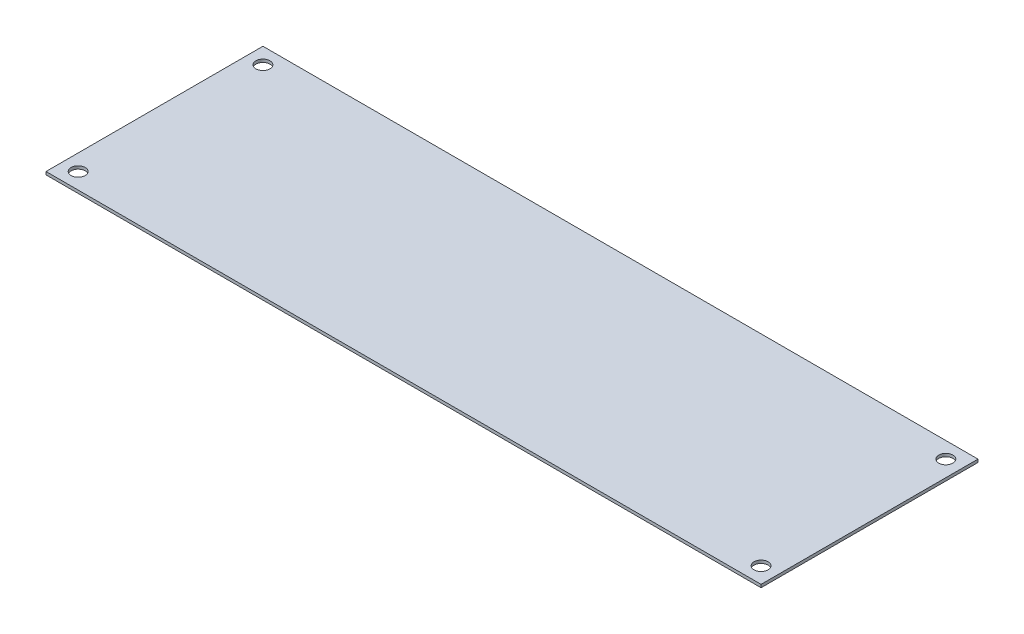
ISO-10303-21;
HEADER;
FILE_DESCRIPTION(('STEP AP214'),'2;1');
FILE_NAME('part.step','',(''),(''),'','','');
FILE_SCHEMA(('AUTOMOTIVE_DESIGN { 1 0 10303 214 1 1 1 1 }'));
ENDSEC;
DATA;
#1=APPLICATION_CONTEXT('core data for automotive mechanical design processes');
#2=APPLICATION_PROTOCOL_DEFINITION('international standard','automotive_design',2000,#1);
#3=PRODUCT_CONTEXT('',#1,'mechanical');
#4=PRODUCT('Part','Part','',(#3));
#5=PRODUCT_RELATED_PRODUCT_CATEGORY('part','',(#4));
#6=PRODUCT_DEFINITION_FORMATION('','',#4);
#7=PRODUCT_DEFINITION_CONTEXT('part definition',#1,'design');
#8=PRODUCT_DEFINITION('design','',#6,#7);
#9=PRODUCT_DEFINITION_SHAPE('','',#8);
#10=(LENGTH_UNIT() NAMED_UNIT(*) SI_UNIT(.MILLI.,.METRE.));
#11=(NAMED_UNIT(*) PLANE_ANGLE_UNIT() SI_UNIT($,.RADIAN.));
#12=(NAMED_UNIT(*) SI_UNIT($,.STERADIAN.) SOLID_ANGLE_UNIT());
#13=UNCERTAINTY_MEASURE_WITH_UNIT(LENGTH_MEASURE(1.E-05),#10,'distance_accuracy_value','');
#14=(GEOMETRIC_REPRESENTATION_CONTEXT(3) GLOBAL_UNCERTAINTY_ASSIGNED_CONTEXT((#13)) GLOBAL_UNIT_ASSIGNED_CONTEXT((#10,
#11,#12)) REPRESENTATION_CONTEXT('',''));
#15=CARTESIAN_POINT('',(0.,0.,0.));
#16=DIRECTION('',(0.,0.,1.));
#17=DIRECTION('',(1.,0.,0.));
#18=AXIS2_PLACEMENT_3D('',#15,#16,#17);
#19=CARTESIAN_POINT('',(89.,-0.7366,27.));
#20=DIRECTION('',(1.,0.,0.));
#21=DIRECTION('',(0.,0.,-1.));
#22=AXIS2_PLACEMENT_3D('',#19,#20,#21);
#23=PLANE('',#22);
#24=DIRECTION('',(0.,0.,-1.));
#25=VECTOR('',#24,1.);
#26=CARTESIAN_POINT('',(89.,0.,27.));
#27=LINE('',#26,#25);
#28=CARTESIAN_POINT('',(89.,0.,27.));
#29=VERTEX_POINT('',#28);
#30=CARTESIAN_POINT('',(89.,0.,-27.));
#31=VERTEX_POINT('',#30);
#32=EDGE_CURVE('E102',#29,#31,#27,.T.);
#33=ORIENTED_EDGE('',*,*,#32,.F.);
#34=DIRECTION('',(0.,1.,0.));
#35=VECTOR('',#34,1.);
#36=CARTESIAN_POINT('',(89.,-0.7366,27.));
#37=LINE('',#36,#35);
#38=CARTESIAN_POINT('',(89.,-0.7366,27.));
#39=VERTEX_POINT('',#38);
#40=EDGE_CURVE('E11',#39,#29,#37,.T.);
#41=ORIENTED_EDGE('',*,*,#40,.F.);
#42=DIRECTION('',(0.,0.,-1.));
#43=VECTOR('',#42,1.);
#44=CARTESIAN_POINT('',(89.,-0.7366,27.));
#45=LINE('',#44,#43);
#46=CARTESIAN_POINT('',(89.,-0.7366,-27.));
#47=VERTEX_POINT('',#46);
#48=EDGE_CURVE('E95',#39,#47,#45,.T.);
#49=ORIENTED_EDGE('',*,*,#48,.T.);
#50=DIRECTION('',(0.,1.,0.));
#51=VECTOR('',#50,1.);
#52=CARTESIAN_POINT('',(89.,-0.7366,-27.));
#53=LINE('',#52,#51);
#54=EDGE_CURVE('E40',#47,#31,#53,.T.);
#55=ORIENTED_EDGE('',*,*,#54,.T.);
#56=EDGE_LOOP('',(#33,#41,#49,#55));
#57=FACE_BOUND('',#56,.T.);
#58=ADVANCED_FACE('F37',(#57),#23,.T.);
#59=CARTESIAN_POINT('',(-89.,-0.7366,27.));
#60=DIRECTION('',(0.,0.,1.));
#61=DIRECTION('',(1.,0.,0.));
#62=AXIS2_PLACEMENT_3D('',#59,#60,#61);
#63=PLANE('',#62);
#64=DIRECTION('',(1.,0.,0.));
#65=VECTOR('',#64,1.);
#66=CARTESIAN_POINT('',(-89.,0.,27.));
#67=LINE('',#66,#65);
#68=CARTESIAN_POINT('',(-89.,0.,27.));
#69=VERTEX_POINT('',#68);
#70=EDGE_CURVE('E97',#69,#29,#67,.T.);
#71=ORIENTED_EDGE('',*,*,#70,.F.);
#72=DIRECTION('',(0.,1.,0.));
#73=VECTOR('',#72,1.);
#74=CARTESIAN_POINT('',(-89.,-0.7366,27.));
#75=LINE('',#74,#73);
#76=CARTESIAN_POINT('',(-89.,-0.7366,27.));
#77=VERTEX_POINT('',#76);
#78=EDGE_CURVE('E46',#77,#69,#75,.T.);
#79=ORIENTED_EDGE('',*,*,#78,.F.);
#80=DIRECTION('',(1.,0.,0.));
#81=VECTOR('',#80,1.);
#82=CARTESIAN_POINT('',(-89.,-0.7366,27.));
#83=LINE('',#82,#81);
#84=EDGE_CURVE('E92',#77,#39,#83,.T.);
#85=ORIENTED_EDGE('',*,*,#84,.T.);
#86=ORIENTED_EDGE('',*,*,#40,.T.);
#87=EDGE_LOOP('',(#71,#79,#85,#86));
#88=FACE_BOUND('',#87,.T.);
#89=ADVANCED_FACE('F113',(#88),#63,.T.);
#90=CARTESIAN_POINT('',(-89.,-0.7366,27.));
#91=DIRECTION('',(-1.,0.,0.));
#92=DIRECTION('',(0.,0.,1.));
#93=AXIS2_PLACEMENT_3D('',#90,#91,#92);
#94=PLANE('',#93);
#95=DIRECTION('',(0.,0.,1.));
#96=VECTOR('',#95,1.);
#97=CARTESIAN_POINT('',(-89.,0.,27.));
#98=LINE('',#97,#96);
#99=CARTESIAN_POINT('',(-89.,0.,-27.));
#100=VERTEX_POINT('',#99);
#101=EDGE_CURVE('E87',#100,#69,#98,.T.);
#102=ORIENTED_EDGE('',*,*,#101,.F.);
#103=DIRECTION('',(0.,1.,0.));
#104=VECTOR('',#103,1.);
#105=CARTESIAN_POINT('',(-89.,-0.7366,-27.));
#106=LINE('',#105,#104);
#107=CARTESIAN_POINT('',(-89.,-0.7366,-27.));
#108=VERTEX_POINT('',#107);
#109=EDGE_CURVE('E82',#108,#100,#106,.T.);
#110=ORIENTED_EDGE('',*,*,#109,.F.);
#111=DIRECTION('',(0.,0.,1.));
#112=VECTOR('',#111,1.);
#113=CARTESIAN_POINT('',(-89.,-0.7366,27.));
#114=LINE('',#113,#112);
#115=EDGE_CURVE('E85',#108,#77,#114,.T.);
#116=ORIENTED_EDGE('',*,*,#115,.T.);
#117=ORIENTED_EDGE('',*,*,#78,.T.);
#118=EDGE_LOOP('',(#102,#110,#116,#117));
#119=FACE_BOUND('',#118,.T.);
#120=ADVANCED_FACE('F84',(#119),#94,.T.);
#121=CARTESIAN_POINT('',(-89.,-0.7366,-27.));
#122=DIRECTION('',(0.,0.,-1.));
#123=DIRECTION('',(-1.,0.,0.));
#124=AXIS2_PLACEMENT_3D('',#121,#122,#123);
#125=PLANE('',#124);
#126=DIRECTION('',(-1.,0.,0.));
#127=VECTOR('',#126,1.);
#128=CARTESIAN_POINT('',(-89.,0.,-27.));
#129=LINE('',#128,#127);
#130=EDGE_CURVE('E105',#31,#100,#129,.T.);
#131=ORIENTED_EDGE('',*,*,#130,.F.);
#132=ORIENTED_EDGE('',*,*,#54,.F.);
#133=DIRECTION('',(-1.,0.,0.));
#134=VECTOR('',#133,1.);
#135=CARTESIAN_POINT('',(-89.,-0.7366,-27.));
#136=LINE('',#135,#134);
#137=EDGE_CURVE('E91',#47,#108,#136,.T.);
#138=ORIENTED_EDGE('',*,*,#137,.T.);
#139=ORIENTED_EDGE('',*,*,#109,.T.);
#140=EDGE_LOOP('',(#131,#132,#138,#139));
#141=FACE_BOUND('',#140,.T.);
#142=ADVANCED_FACE('F94',(#141),#125,.T.);
#143=CARTESIAN_POINT('',(0.,-0.7366,0.));
#144=DIRECTION('',(0.,-1.,0.));
#145=DIRECTION('',(0.,0.,-1.));
#146=AXIS2_PLACEMENT_3D('',#143,#144,#145);
#147=PLANE('',#146);
#148=CARTESIAN_POINT('',(-85.,-0.7366,-23.));
#149=DIRECTION('',(0.,1.,0.));
#150=DIRECTION('',(0.,0.,1.));
#151=AXIS2_PLACEMENT_3D('',#148,#149,#150);
#152=CIRCLE('',#151,1.75);
#153=CARTESIAN_POINT('',(-85.,-0.7366,-21.25));
#154=VERTEX_POINT('',#153);
#155=EDGE_CURVE('E154',#154,#154,#152,.T.);
#156=ORIENTED_EDGE('',*,*,#155,.T.);
#157=EDGE_LOOP('',(#156));
#158=FACE_BOUND('',#157,.T.);
#159=CARTESIAN_POINT('',(-85.,-0.7366,23.));
#160=DIRECTION('',(0.,1.,0.));
#161=DIRECTION('',(0.,0.,1.));
#162=AXIS2_PLACEMENT_3D('',#159,#160,#161);
#163=CIRCLE('',#162,1.75);
#164=CARTESIAN_POINT('',(-85.,-0.7366,24.75));
#165=VERTEX_POINT('',#164);
#166=EDGE_CURVE('E162',#165,#165,#163,.T.);
#167=ORIENTED_EDGE('',*,*,#166,.T.);
#168=EDGE_LOOP('',(#167));
#169=FACE_BOUND('',#168,.T.);
#170=CARTESIAN_POINT('',(85.,-0.7366,23.));
#171=DIRECTION('',(0.,1.,0.));
#172=DIRECTION('',(0.,0.,1.));
#173=AXIS2_PLACEMENT_3D('',#170,#171,#172);
#174=CIRCLE('',#173,1.75);
#175=CARTESIAN_POINT('',(85.,-0.7366,24.75));
#176=VERTEX_POINT('',#175);
#177=EDGE_CURVE('E168',#176,#176,#174,.T.);
#178=ORIENTED_EDGE('',*,*,#177,.T.);
#179=EDGE_LOOP('',(#178));
#180=FACE_BOUND('',#179,.T.);
#181=CARTESIAN_POINT('',(85.,-0.7366,-23.));
#182=DIRECTION('',(0.,1.,0.));
#183=DIRECTION('',(0.,0.,1.));
#184=AXIS2_PLACEMENT_3D('',#181,#182,#183);
#185=CIRCLE('',#184,1.75);
#186=CARTESIAN_POINT('',(85.,-0.7366,-21.25));
#187=VERTEX_POINT('',#186);
#188=EDGE_CURVE('E106',#187,#187,#185,.T.);
#189=ORIENTED_EDGE('',*,*,#188,.T.);
#190=EDGE_LOOP('',(#189));
#191=FACE_BOUND('',#190,.T.);
#192=ORIENTED_EDGE('',*,*,#48,.F.);
#193=ORIENTED_EDGE('',*,*,#84,.F.);
#194=ORIENTED_EDGE('',*,*,#115,.F.);
#195=ORIENTED_EDGE('',*,*,#137,.F.);
#196=EDGE_LOOP('',(#192,#193,#194,#195));
#197=FACE_BOUND('',#196,.T.);
#198=ADVANCED_FACE('F90',(#158,#169,#180,#191,#197),#147,.T.);
#199=CARTESIAN_POINT('',(0.,0.,0.));
#200=DIRECTION('',(0.,-1.,0.));
#201=DIRECTION('',(0.,0.,-1.));
#202=AXIS2_PLACEMENT_3D('',#199,#200,#201);
#203=PLANE('',#202);
#204=CARTESIAN_POINT('',(-85.,0.,-23.));
#205=DIRECTION('',(0.,1.,0.));
#206=DIRECTION('',(0.,0.,1.));
#207=AXIS2_PLACEMENT_3D('',#204,#205,#206);
#208=CIRCLE('',#207,1.75);
#209=CARTESIAN_POINT('',(-85.,0.,-21.25));
#210=VERTEX_POINT('',#209);
#211=EDGE_CURVE('E157',#210,#210,#208,.T.);
#212=ORIENTED_EDGE('',*,*,#211,.F.);
#213=EDGE_LOOP('',(#212));
#214=FACE_BOUND('',#213,.T.);
#215=CARTESIAN_POINT('',(-85.,0.,23.));
#216=DIRECTION('',(0.,1.,0.));
#217=DIRECTION('',(0.,0.,1.));
#218=AXIS2_PLACEMENT_3D('',#215,#216,#217);
#219=CIRCLE('',#218,1.75);
#220=CARTESIAN_POINT('',(-85.,0.,24.75));
#221=VERTEX_POINT('',#220);
#222=EDGE_CURVE('E159',#221,#221,#219,.T.);
#223=ORIENTED_EDGE('',*,*,#222,.F.);
#224=EDGE_LOOP('',(#223));
#225=FACE_BOUND('',#224,.T.);
#226=CARTESIAN_POINT('',(85.,0.,23.));
#227=DIRECTION('',(0.,1.,0.));
#228=DIRECTION('',(0.,0.,1.));
#229=AXIS2_PLACEMENT_3D('',#226,#227,#228);
#230=CIRCLE('',#229,1.75);
#231=CARTESIAN_POINT('',(85.,0.,24.75));
#232=VERTEX_POINT('',#231);
#233=EDGE_CURVE('E165',#232,#232,#230,.T.);
#234=ORIENTED_EDGE('',*,*,#233,.F.);
#235=EDGE_LOOP('',(#234));
#236=FACE_BOUND('',#235,.T.);
#237=CARTESIAN_POINT('',(85.,0.,-23.));
#238=DIRECTION('',(0.,1.,0.));
#239=DIRECTION('',(0.,0.,1.));
#240=AXIS2_PLACEMENT_3D('',#237,#238,#239);
#241=CIRCLE('',#240,1.75);
#242=CARTESIAN_POINT('',(85.,0.,-21.25));
#243=VERTEX_POINT('',#242);
#244=EDGE_CURVE('E171',#243,#243,#241,.T.);
#245=ORIENTED_EDGE('',*,*,#244,.F.);
#246=EDGE_LOOP('',(#245));
#247=FACE_BOUND('',#246,.T.);
#248=ORIENTED_EDGE('',*,*,#32,.T.);
#249=ORIENTED_EDGE('',*,*,#130,.T.);
#250=ORIENTED_EDGE('',*,*,#101,.T.);
#251=ORIENTED_EDGE('',*,*,#70,.T.);
#252=EDGE_LOOP('',(#248,#249,#250,#251));
#253=FACE_BOUND('',#252,.T.);
#254=ADVANCED_FACE('F112',(#214,#225,#236,#247,#253),#203,.F.);
#255=CARTESIAN_POINT('',(85.,-0.7366,-23.));
#256=DIRECTION('',(0.,1.,0.));
#257=DIRECTION('',(0.,0.,1.));
#258=AXIS2_PLACEMENT_3D('',#255,#256,#257);
#259=CYLINDRICAL_SURFACE('',#258,1.75);
#260=ORIENTED_EDGE('',*,*,#188,.F.);
#261=EDGE_LOOP('',(#260));
#262=FACE_BOUND('',#261,.T.);
#263=ORIENTED_EDGE('',*,*,#244,.T.);
#264=EDGE_LOOP('',(#263));
#265=FACE_BOUND('',#264,.T.);
#266=ADVANCED_FACE('F131',(#262,#265),#259,.F.);
#267=CARTESIAN_POINT('',(85.,-0.7366,23.));
#268=DIRECTION('',(0.,1.,0.));
#269=DIRECTION('',(0.,0.,1.));
#270=AXIS2_PLACEMENT_3D('',#267,#268,#269);
#271=CYLINDRICAL_SURFACE('',#270,1.75);
#272=ORIENTED_EDGE('',*,*,#177,.F.);
#273=EDGE_LOOP('',(#272));
#274=FACE_BOUND('',#273,.T.);
#275=ORIENTED_EDGE('',*,*,#233,.T.);
#276=EDGE_LOOP('',(#275));
#277=FACE_BOUND('',#276,.T.);
#278=ADVANCED_FACE('F138',(#274,#277),#271,.F.);
#279=CARTESIAN_POINT('',(-85.,-0.7366,23.));
#280=DIRECTION('',(0.,1.,0.));
#281=DIRECTION('',(0.,0.,1.));
#282=AXIS2_PLACEMENT_3D('',#279,#280,#281);
#283=CYLINDRICAL_SURFACE('',#282,1.75);
#284=ORIENTED_EDGE('',*,*,#166,.F.);
#285=EDGE_LOOP('',(#284));
#286=FACE_BOUND('',#285,.T.);
#287=ORIENTED_EDGE('',*,*,#222,.T.);
#288=EDGE_LOOP('',(#287));
#289=FACE_BOUND('',#288,.T.);
#290=ADVANCED_FACE('F142',(#286,#289),#283,.F.);
#291=CARTESIAN_POINT('',(-85.,-0.7366,-23.));
#292=DIRECTION('',(0.,1.,0.));
#293=DIRECTION('',(0.,0.,1.));
#294=AXIS2_PLACEMENT_3D('',#291,#292,#293);
#295=CYLINDRICAL_SURFACE('',#294,1.75);
#296=ORIENTED_EDGE('',*,*,#155,.F.);
#297=EDGE_LOOP('',(#296));
#298=FACE_BOUND('',#297,.T.);
#299=ORIENTED_EDGE('',*,*,#211,.T.);
#300=EDGE_LOOP('',(#299));
#301=FACE_BOUND('',#300,.T.);
#302=ADVANCED_FACE('F146',(#298,#301),#295,.F.);
#303=CLOSED_SHELL('',(#58,#89,#120,#142,#198,#254,#266,#278,#290,#302));
#304=MANIFOLD_SOLID_BREP('B2',#303);
#305=ADVANCED_BREP_SHAPE_REPRESENTATION('',(#18,#304),#14);
#306=SHAPE_DEFINITION_REPRESENTATION(#9,#305);
ENDSEC;
END-ISO-10303-21;
